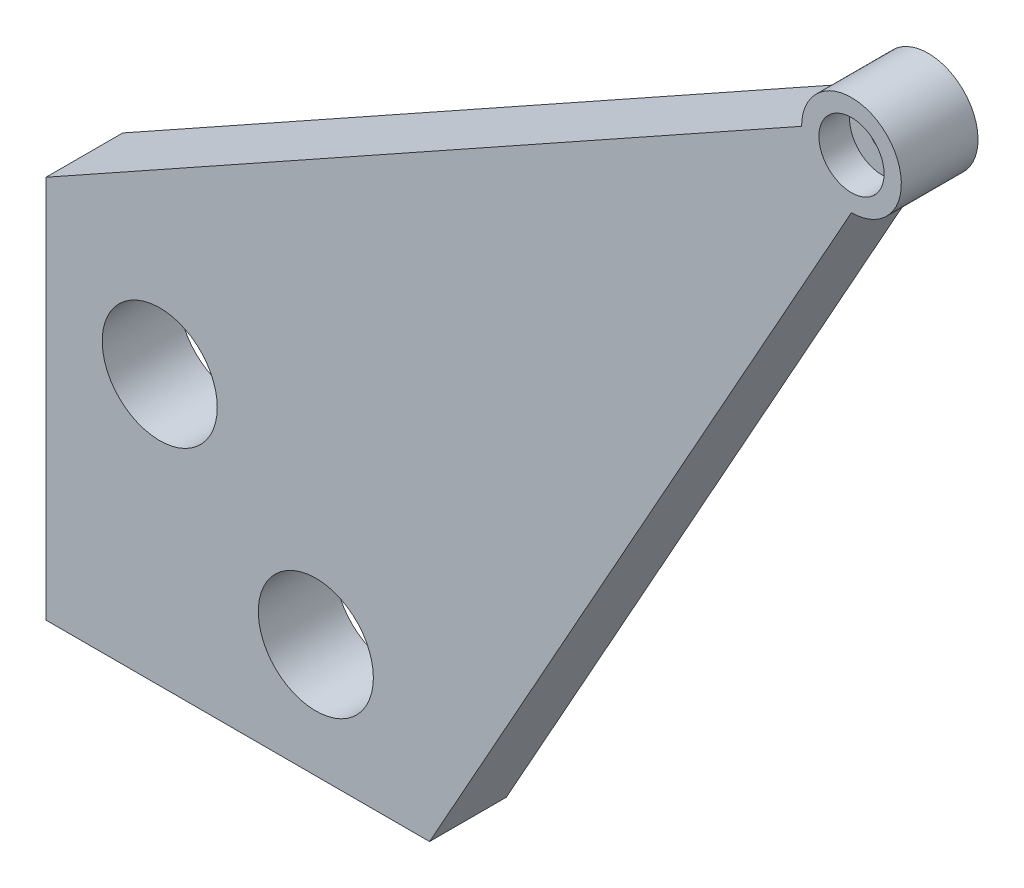
ISO-10303-21;
HEADER;
FILE_DESCRIPTION(('STEP AP214'),'2;1');
FILE_NAME('part.step','',(''),(''),'','','');
FILE_SCHEMA(('AUTOMOTIVE_DESIGN { 1 0 10303 214 1 1 1 1 }'));
ENDSEC;
DATA;
#1=APPLICATION_CONTEXT('core data for automotive mechanical design processes');
#2=APPLICATION_PROTOCOL_DEFINITION('international standard','automotive_design',2000,#1);
#3=PRODUCT_CONTEXT('',#1,'mechanical');
#4=PRODUCT('Part','Part','',(#3));
#5=PRODUCT_RELATED_PRODUCT_CATEGORY('part','',(#4));
#6=PRODUCT_DEFINITION_FORMATION('','',#4);
#7=PRODUCT_DEFINITION_CONTEXT('part definition',#1,'design');
#8=PRODUCT_DEFINITION('design','',#6,#7);
#9=PRODUCT_DEFINITION_SHAPE('','',#8);
#10=(LENGTH_UNIT() NAMED_UNIT(*) SI_UNIT(.MILLI.,.METRE.));
#11=(NAMED_UNIT(*) PLANE_ANGLE_UNIT() SI_UNIT($,.RADIAN.));
#12=(NAMED_UNIT(*) SI_UNIT($,.STERADIAN.) SOLID_ANGLE_UNIT());
#13=UNCERTAINTY_MEASURE_WITH_UNIT(LENGTH_MEASURE(1.E-05),#10,'distance_accuracy_value','');
#14=(GEOMETRIC_REPRESENTATION_CONTEXT(3) GLOBAL_UNCERTAINTY_ASSIGNED_CONTEXT((#13)) GLOBAL_UNIT_ASSIGNED_CONTEXT((#10,
#11,#12)) REPRESENTATION_CONTEXT('',''));
#15=CARTESIAN_POINT('',(0.,0.,0.));
#16=DIRECTION('',(0.,0.,1.));
#17=DIRECTION('',(1.,0.,0.));
#18=AXIS2_PLACEMENT_3D('',#15,#16,#17);
#19=CARTESIAN_POINT('',(0.,0.,5.));
#20=DIRECTION('',(1.,0.,0.));
#21=DIRECTION('',(0.,1.,0.));
#22=AXIS2_PLACEMENT_3D('',#19,#20,#21);
#23=PLANE('',#22);
#24=DIRECTION('',(0.,-1.,0.));
#25=VECTOR('',#24,1.);
#26=CARTESIAN_POINT('',(0.,0.,-5.));
#27=LINE('',#26,#25);
#28=CARTESIAN_POINT('',(0.,50.,-5.));
#29=VERTEX_POINT('',#28);
#30=CARTESIAN_POINT('',(0.,0.,-5.));
#31=VERTEX_POINT('',#30);
#32=EDGE_CURVE('E117',#29,#31,#27,.T.);
#33=ORIENTED_EDGE('',*,*,#32,.T.);
#34=DIRECTION('',(0.,0.,-1.));
#35=VECTOR('',#34,1.);
#36=CARTESIAN_POINT('',(0.,0.,5.));
#37=LINE('',#36,#35);
#38=CARTESIAN_POINT('',(0.,0.,5.));
#39=VERTEX_POINT('',#38);
#40=EDGE_CURVE('E11',#39,#31,#37,.T.);
#41=ORIENTED_EDGE('',*,*,#40,.F.);
#42=DIRECTION('',(0.,-1.,0.));
#43=VECTOR('',#42,1.);
#44=CARTESIAN_POINT('',(0.,0.,5.));
#45=LINE('',#44,#43);
#46=CARTESIAN_POINT('',(0.,50.,5.));
#47=VERTEX_POINT('',#46);
#48=EDGE_CURVE('E131',#47,#39,#45,.T.);
#49=ORIENTED_EDGE('',*,*,#48,.F.);
#50=DIRECTION('',(0.,0.,-1.));
#51=VECTOR('',#50,1.);
#52=CARTESIAN_POINT('',(0.,50.,5.));
#53=LINE('',#52,#51);
#54=EDGE_CURVE('E113',#47,#29,#53,.T.);
#55=ORIENTED_EDGE('',*,*,#54,.T.);
#56=EDGE_LOOP('',(#33,#41,#49,#55));
#57=FACE_BOUND('',#56,.T.);
#58=ADVANCED_FACE('F38',(#57),#23,.F.);
#59=CARTESIAN_POINT('',(0.,0.,5.));
#60=DIRECTION('',(0.,1.,0.));
#61=DIRECTION('',(0.,0.,1.));
#62=AXIS2_PLACEMENT_3D('',#59,#60,#61);
#63=PLANE('',#62);
#64=DIRECTION('',(1.,0.,0.));
#65=VECTOR('',#64,1.);
#66=CARTESIAN_POINT('',(0.,0.,-5.));
#67=LINE('',#66,#65);
#68=CARTESIAN_POINT('',(50.,0.,-5.));
#69=VERTEX_POINT('',#68);
#70=EDGE_CURVE('E121',#31,#69,#67,.T.);
#71=ORIENTED_EDGE('',*,*,#70,.T.);
#72=DIRECTION('',(0.,0.,-1.));
#73=VECTOR('',#72,1.);
#74=CARTESIAN_POINT('',(50.,0.,5.));
#75=LINE('',#74,#73);
#76=CARTESIAN_POINT('',(50.,0.,5.));
#77=VERTEX_POINT('',#76);
#78=EDGE_CURVE('E47',#77,#69,#75,.T.);
#79=ORIENTED_EDGE('',*,*,#78,.F.);
#80=DIRECTION('',(1.,0.,0.));
#81=VECTOR('',#80,1.);
#82=CARTESIAN_POINT('',(0.,0.,5.));
#83=LINE('',#82,#81);
#84=EDGE_CURVE('E89',#39,#77,#83,.T.);
#85=ORIENTED_EDGE('',*,*,#84,.F.);
#86=ORIENTED_EDGE('',*,*,#40,.T.);
#87=EDGE_LOOP('',(#71,#79,#85,#86));
#88=FACE_BOUND('',#87,.T.);
#89=ADVANCED_FACE('F155',(#88),#63,.F.);
#90=CARTESIAN_POINT('',(50.,0.,5.));
#91=DIRECTION('',(-0.873109961084313,0.487523328524236,0.));
#92=DIRECTION('',(-0.487523328524236,-0.873109961084313,0.));
#93=AXIS2_PLACEMENT_3D('',#90,#91,#92);
#94=PLANE('',#93);
#95=DIRECTION('',(0.487523328524236,0.873109961084313,0.));
#96=VECTOR('',#95,1.);
#97=CARTESIAN_POINT('',(50.,0.,-5.));
#98=LINE('',#97,#96);
#99=CARTESIAN_POINT('',(105.,98.5,-5.));
#100=VERTEX_POINT('',#99);
#101=EDGE_CURVE('E105',#69,#100,#98,.T.);
#102=ORIENTED_EDGE('',*,*,#101,.T.);
#103=DIRECTION('',(0.,0.,-1.));
#104=VECTOR('',#103,1.);
#105=CARTESIAN_POINT('',(105.,98.5,5.));
#106=LINE('',#105,#104);
#107=CARTESIAN_POINT('',(105.,98.5,5.));
#108=VERTEX_POINT('',#107);
#109=EDGE_CURVE('E102',#108,#100,#106,.T.);
#110=ORIENTED_EDGE('',*,*,#109,.F.);
#111=DIRECTION('',(0.487523328524236,0.873109961084313,0.));
#112=VECTOR('',#111,1.);
#113=CARTESIAN_POINT('',(50.,0.,5.));
#114=LINE('',#113,#112);
#115=EDGE_CURVE('E93',#77,#108,#114,.T.);
#116=ORIENTED_EDGE('',*,*,#115,.F.);
#117=ORIENTED_EDGE('',*,*,#78,.T.);
#118=EDGE_LOOP('',(#102,#110,#116,#117));
#119=FACE_BOUND('',#118,.T.);
#120=ADVANCED_FACE('F103',(#119),#94,.F.);
#121=CARTESIAN_POINT('',(105.,105.,5.));
#122=DIRECTION('',(0.,0.,-1.));
#123=DIRECTION('',(-1.,0.,0.));
#124=AXIS2_PLACEMENT_3D('',#121,#122,#123);
#125=CYLINDRICAL_SURFACE('',#124,6.50000000000001);
#126=CARTESIAN_POINT('',(105.,105.,-5.));
#127=DIRECTION('',(0.,0.,1.));
#128=DIRECTION('',(1.,0.,0.));
#129=AXIS2_PLACEMENT_3D('',#126,#127,#128);
#130=CIRCLE('',#129,6.50000000000001);
#131=CARTESIAN_POINT('',(98.5,105.,-5.));
#132=VERTEX_POINT('',#131);
#133=EDGE_CURVE('E75',#100,#132,#130,.T.);
#134=ORIENTED_EDGE('',*,*,#133,.T.);
#135=DIRECTION('',(0.,0.,-1.));
#136=VECTOR('',#135,1.);
#137=CARTESIAN_POINT('',(98.5,105.,5.));
#138=LINE('',#137,#136);
#139=CARTESIAN_POINT('',(98.5,105.,5.));
#140=VERTEX_POINT('',#139);
#141=EDGE_CURVE('E107',#140,#132,#138,.T.);
#142=ORIENTED_EDGE('',*,*,#141,.F.);
#143=CARTESIAN_POINT('',(105.,105.,5.));
#144=DIRECTION('',(0.,0.,1.));
#145=DIRECTION('',(1.,0.,0.));
#146=AXIS2_PLACEMENT_3D('',#143,#144,#145);
#147=CIRCLE('',#146,6.50000000000001);
#148=EDGE_CURVE('E97',#108,#140,#147,.T.);
#149=ORIENTED_EDGE('',*,*,#148,.F.);
#150=ORIENTED_EDGE('',*,*,#109,.T.);
#151=EDGE_LOOP('',(#134,#142,#149,#150));
#152=FACE_BOUND('',#151,.T.);
#153=ADVANCED_FACE('F109',(#152),#125,.T.);
#154=CARTESIAN_POINT('',(0.,50.,5.));
#155=DIRECTION('',(0.487523328524236,-0.873109961084313,0.));
#156=DIRECTION('',(0.873109961084313,0.487523328524236,0.));
#157=AXIS2_PLACEMENT_3D('',#154,#155,#156);
#158=PLANE('',#157);
#159=DIRECTION('',(-0.873109961084313,-0.487523328524236,0.));
#160=VECTOR('',#159,1.);
#161=CARTESIAN_POINT('',(0.,50.,-5.));
#162=LINE('',#161,#160);
#163=EDGE_CURVE('E81',#132,#29,#162,.T.);
#164=ORIENTED_EDGE('',*,*,#163,.T.);
#165=ORIENTED_EDGE('',*,*,#54,.F.);
#166=DIRECTION('',(-0.873109961084313,-0.487523328524236,0.));
#167=VECTOR('',#166,1.);
#168=CARTESIAN_POINT('',(0.,50.,5.));
#169=LINE('',#168,#167);
#170=EDGE_CURVE('E55',#140,#47,#169,.T.);
#171=ORIENTED_EDGE('',*,*,#170,.F.);
#172=ORIENTED_EDGE('',*,*,#141,.T.);
#173=EDGE_LOOP('',(#164,#165,#171,#172));
#174=FACE_BOUND('',#173,.T.);
#175=ADVANCED_FACE('F142',(#174),#158,.F.);
#176=CARTESIAN_POINT('',(105.,105.,5.));
#177=DIRECTION('',(0.,0.,1.));
#178=DIRECTION('',(1.,0.,0.));
#179=AXIS2_PLACEMENT_3D('',#176,#177,#178);
#180=PLANE('',#179);
#181=CARTESIAN_POINT('',(14.8255588340632,35.1744411659368,5.));
#182=DIRECTION('',(0.,0.,1.));
#183=DIRECTION('',(1.,0.,0.));
#184=AXIS2_PLACEMENT_3D('',#181,#182,#183);
#185=CIRCLE('',#184,7.5);
#186=CARTESIAN_POINT('',(22.3255588340632,35.1744411659368,5.));
#187=VERTEX_POINT('',#186);
#188=EDGE_CURVE('E242',#187,#187,#185,.T.);
#189=ORIENTED_EDGE('',*,*,#188,.F.);
#190=EDGE_LOOP('',(#189));
#191=FACE_BOUND('',#190,.T.);
#192=CARTESIAN_POINT('',(35.1744411659368,14.8255588340632,5.));
#193=DIRECTION('',(0.,0.,1.));
#194=DIRECTION('',(1.,0.,0.));
#195=AXIS2_PLACEMENT_3D('',#192,#193,#194);
#196=CIRCLE('',#195,7.5);
#197=CARTESIAN_POINT('',(42.6744411659368,14.8255588340632,5.));
#198=VERTEX_POINT('',#197);
#199=EDGE_CURVE('E251',#198,#198,#196,.T.);
#200=ORIENTED_EDGE('',*,*,#199,.F.);
#201=EDGE_LOOP('',(#200));
#202=FACE_BOUND('',#201,.T.);
#203=CARTESIAN_POINT('',(105.,105.,5.));
#204=DIRECTION('',(0.,0.,1.));
#205=DIRECTION('',(1.,0.,0.));
#206=AXIS2_PLACEMENT_3D('',#203,#204,#205);
#207=CIRCLE('',#206,4.25000000000001);
#208=CARTESIAN_POINT('',(109.25,105.,5.));
#209=VERTEX_POINT('',#208);
#210=EDGE_CURVE('E261',#209,#209,#207,.T.);
#211=ORIENTED_EDGE('',*,*,#210,.F.);
#212=EDGE_LOOP('',(#211));
#213=FACE_BOUND('',#212,.T.);
#214=ORIENTED_EDGE('',*,*,#48,.T.);
#215=ORIENTED_EDGE('',*,*,#84,.T.);
#216=ORIENTED_EDGE('',*,*,#115,.T.);
#217=ORIENTED_EDGE('',*,*,#148,.T.);
#218=ORIENTED_EDGE('',*,*,#170,.T.);
#219=EDGE_LOOP('',(#214,#215,#216,#217,#218));
#220=FACE_BOUND('',#219,.T.);
#221=ADVANCED_FACE('F95',(#191,#202,#213,#220),#180,.T.);
#222=CARTESIAN_POINT('',(105.,105.,-5.));
#223=DIRECTION('',(0.,0.,1.));
#224=DIRECTION('',(1.,0.,0.));
#225=AXIS2_PLACEMENT_3D('',#222,#223,#224);
#226=PLANE('',#225);
#227=CARTESIAN_POINT('',(14.8255588340632,35.1744411659368,-5.));
#228=DIRECTION('',(0.,0.,1.));
#229=DIRECTION('',(1.,0.,0.));
#230=AXIS2_PLACEMENT_3D('',#227,#228,#229);
#231=CIRCLE('',#230,7.5);
#232=CARTESIAN_POINT('',(22.3255588340632,35.1744411659368,-5.));
#233=VERTEX_POINT('',#232);
#234=EDGE_CURVE('E239',#233,#233,#231,.T.);
#235=ORIENTED_EDGE('',*,*,#234,.T.);
#236=EDGE_LOOP('',(#235));
#237=FACE_BOUND('',#236,.T.);
#238=CARTESIAN_POINT('',(35.1744411659368,14.8255588340632,-5.));
#239=DIRECTION('',(0.,0.,1.));
#240=DIRECTION('',(1.,0.,0.));
#241=AXIS2_PLACEMENT_3D('',#238,#239,#240);
#242=CIRCLE('',#241,7.5);
#243=CARTESIAN_POINT('',(42.6744411659368,14.8255588340632,-5.));
#244=VERTEX_POINT('',#243);
#245=EDGE_CURVE('E244',#244,#244,#242,.T.);
#246=ORIENTED_EDGE('',*,*,#245,.T.);
#247=EDGE_LOOP('',(#246));
#248=FACE_BOUND('',#247,.T.);
#249=CARTESIAN_POINT('',(105.,105.,-5.));
#250=DIRECTION('',(0.,0.,1.));
#251=DIRECTION('',(1.,0.,0.));
#252=AXIS2_PLACEMENT_3D('',#249,#250,#251);
#253=CIRCLE('',#252,1.5);
#254=CARTESIAN_POINT('',(106.5,105.,-5.));
#255=VERTEX_POINT('',#254);
#256=EDGE_CURVE('E257',#255,#255,#253,.T.);
#257=ORIENTED_EDGE('',*,*,#256,.T.);
#258=EDGE_LOOP('',(#257));
#259=FACE_BOUND('',#258,.T.);
#260=ORIENTED_EDGE('',*,*,#32,.F.);
#261=ORIENTED_EDGE('',*,*,#163,.F.);
#262=ORIENTED_EDGE('',*,*,#133,.F.);
#263=ORIENTED_EDGE('',*,*,#101,.F.);
#264=ORIENTED_EDGE('',*,*,#70,.F.);
#265=EDGE_LOOP('',(#260,#261,#262,#263,#264));
#266=FACE_BOUND('',#265,.T.);
#267=ADVANCED_FACE('F138',(#237,#248,#259,#266),#226,.F.);
#268=CARTESIAN_POINT('',(105.,105.,1.));
#269=DIRECTION('',(0.,0.,1.));
#270=DIRECTION('',(1.,0.,0.));
#271=AXIS2_PLACEMENT_3D('',#268,#269,#270);
#272=CYLINDRICAL_SURFACE('',#271,4.25000000000001);
#273=CARTESIAN_POINT('',(105.,105.,1.));
#274=DIRECTION('',(0.,0.,1.));
#275=DIRECTION('',(1.,0.,0.));
#276=AXIS2_PLACEMENT_3D('',#273,#274,#275);
#277=CIRCLE('',#276,4.25000000000001);
#278=CARTESIAN_POINT('',(109.25,105.,1.));
#279=VERTEX_POINT('',#278);
#280=EDGE_CURVE('E122',#279,#279,#277,.T.);
#281=ORIENTED_EDGE('',*,*,#280,.F.);
#282=EDGE_LOOP('',(#281));
#283=FACE_BOUND('',#282,.T.);
#284=ORIENTED_EDGE('',*,*,#210,.T.);
#285=EDGE_LOOP('',(#284));
#286=FACE_BOUND('',#285,.T.);
#287=ADVANCED_FACE('F179',(#283,#286),#272,.F.);
#288=CARTESIAN_POINT('',(105.,105.,1.));
#289=DIRECTION('',(0.,0.,1.));
#290=DIRECTION('',(1.,0.,0.));
#291=AXIS2_PLACEMENT_3D('',#288,#289,#290);
#292=PLANE('',#291);
#293=CARTESIAN_POINT('',(105.,105.,1.));
#294=DIRECTION('',(0.,0.,1.));
#295=DIRECTION('',(1.,0.,0.));
#296=AXIS2_PLACEMENT_3D('',#293,#294,#295);
#297=CIRCLE('',#296,1.5);
#298=CARTESIAN_POINT('',(106.5,105.,1.));
#299=VERTEX_POINT('',#298);
#300=EDGE_CURVE('E248',#299,#299,#297,.T.);
#301=ORIENTED_EDGE('',*,*,#300,.F.);
#302=EDGE_LOOP('',(#301));
#303=FACE_BOUND('',#302,.T.);
#304=ORIENTED_EDGE('',*,*,#280,.T.);
#305=EDGE_LOOP('',(#304));
#306=FACE_BOUND('',#305,.T.);
#307=ADVANCED_FACE('F184',(#303,#306),#292,.T.);
#308=CARTESIAN_POINT('',(105.,105.,-5.));
#309=DIRECTION('',(0.,0.,1.));
#310=DIRECTION('',(1.,0.,0.));
#311=AXIS2_PLACEMENT_3D('',#308,#309,#310);
#312=CYLINDRICAL_SURFACE('',#311,1.5);
#313=ORIENTED_EDGE('',*,*,#256,.F.);
#314=EDGE_LOOP('',(#313));
#315=FACE_BOUND('',#314,.T.);
#316=ORIENTED_EDGE('',*,*,#300,.T.);
#317=EDGE_LOOP('',(#316));
#318=FACE_BOUND('',#317,.T.);
#319=ADVANCED_FACE('F196',(#315,#318),#312,.F.);
#320=CARTESIAN_POINT('',(35.1744411659368,14.8255588340632,-5.));
#321=DIRECTION('',(0.,0.,1.));
#322=DIRECTION('',(1.,0.,0.));
#323=AXIS2_PLACEMENT_3D('',#320,#321,#322);
#324=CYLINDRICAL_SURFACE('',#323,7.5);
#325=ORIENTED_EDGE('',*,*,#245,.F.);
#326=EDGE_LOOP('',(#325));
#327=FACE_BOUND('',#326,.T.);
#328=ORIENTED_EDGE('',*,*,#199,.T.);
#329=EDGE_LOOP('',(#328));
#330=FACE_BOUND('',#329,.T.);
#331=ADVANCED_FACE('F205',(#327,#330),#324,.F.);
#332=CARTESIAN_POINT('',(14.8255588340632,35.1744411659368,-5.));
#333=DIRECTION('',(0.,0.,1.));
#334=DIRECTION('',(1.,0.,0.));
#335=AXIS2_PLACEMENT_3D('',#332,#333,#334);
#336=CYLINDRICAL_SURFACE('',#335,7.5);
#337=ORIENTED_EDGE('',*,*,#234,.F.);
#338=EDGE_LOOP('',(#337));
#339=FACE_BOUND('',#338,.T.);
#340=ORIENTED_EDGE('',*,*,#188,.T.);
#341=EDGE_LOOP('',(#340));
#342=FACE_BOUND('',#341,.T.);
#343=ADVANCED_FACE('F222',(#339,#342),#336,.F.);
#344=CLOSED_SHELL('',(#58,#89,#120,#153,#175,#221,#267,#287,#307,#319,#331,#343));
#345=MANIFOLD_SOLID_BREP('B2',#344);
#346=ADVANCED_BREP_SHAPE_REPRESENTATION('',(#18,#345),#14);
#347=SHAPE_DEFINITION_REPRESENTATION(#9,#346);
ENDSEC;
END-ISO-10303-21;
